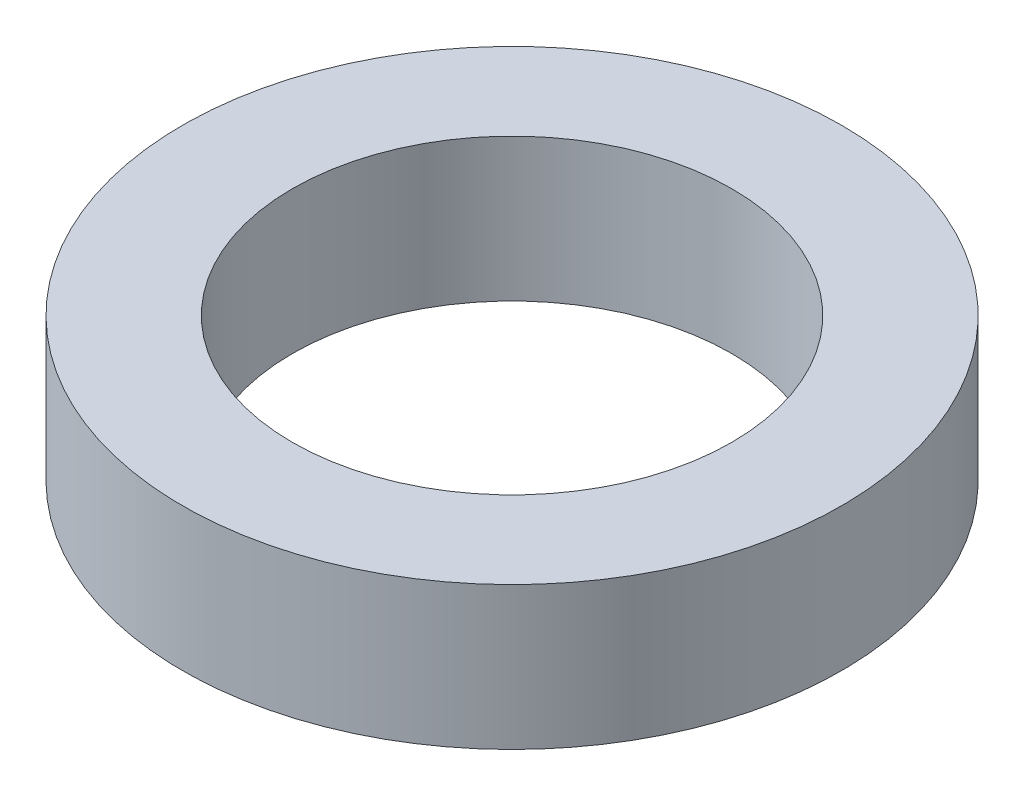
ISO-10303-21;
HEADER;
FILE_DESCRIPTION(('STEP AP214'),'2;1');
FILE_NAME('part.step','',(''),(''),'','','');
FILE_SCHEMA(('AUTOMOTIVE_DESIGN { 1 0 10303 214 1 1 1 1 }'));
ENDSEC;
DATA;
#1=APPLICATION_CONTEXT('core data for automotive mechanical design processes');
#2=APPLICATION_PROTOCOL_DEFINITION('international standard','automotive_design',2000,#1);
#3=PRODUCT_CONTEXT('',#1,'mechanical');
#4=PRODUCT('Part','Part','',(#3));
#5=PRODUCT_RELATED_PRODUCT_CATEGORY('part','',(#4));
#6=PRODUCT_DEFINITION_FORMATION('','',#4);
#7=PRODUCT_DEFINITION_CONTEXT('part definition',#1,'design');
#8=PRODUCT_DEFINITION('design','',#6,#7);
#9=PRODUCT_DEFINITION_SHAPE('','',#8);
#10=(LENGTH_UNIT() NAMED_UNIT(*) SI_UNIT(.MILLI.,.METRE.));
#11=(NAMED_UNIT(*) PLANE_ANGLE_UNIT() SI_UNIT($,.RADIAN.));
#12=(NAMED_UNIT(*) SI_UNIT($,.STERADIAN.) SOLID_ANGLE_UNIT());
#13=UNCERTAINTY_MEASURE_WITH_UNIT(LENGTH_MEASURE(1.E-05),#10,'distance_accuracy_value','');
#14=(GEOMETRIC_REPRESENTATION_CONTEXT(3) GLOBAL_UNCERTAINTY_ASSIGNED_CONTEXT((#13)) GLOBAL_UNIT_ASSIGNED_CONTEXT((#10,
#11,#12)) REPRESENTATION_CONTEXT('',''));
#15=CARTESIAN_POINT('',(0.,0.,0.));
#16=DIRECTION('',(0.,0.,1.));
#17=DIRECTION('',(1.,0.,0.));
#18=AXIS2_PLACEMENT_3D('',#15,#16,#17);
#19=CARTESIAN_POINT('',(0.,13.,0.));
#20=DIRECTION('',(0.,1.,0.));
#21=DIRECTION('',(0.,0.,1.));
#22=AXIS2_PLACEMENT_3D('',#19,#20,#21);
#23=PLANE('',#22);
#24=CARTESIAN_POINT('',(0.,13.,0.));
#25=DIRECTION('',(0.,1.,0.));
#26=DIRECTION('',(0.,0.,1.));
#27=AXIS2_PLACEMENT_3D('',#24,#25,#26);
#28=CIRCLE('',#27,30.);
#29=CARTESIAN_POINT('',(0.,13.,-30.));
#30=VERTEX_POINT('',#29);
#31=EDGE_CURVE('E10',#30,#30,#28,.T.);
#32=ORIENTED_EDGE('',*,*,#31,.T.);
#33=EDGE_LOOP('',(#32));
#34=FACE_BOUND('',#33,.T.);
#35=CARTESIAN_POINT('',(0.,13.,0.));
#36=DIRECTION('',(0.,1.,0.));
#37=DIRECTION('',(0.,0.,1.));
#38=AXIS2_PLACEMENT_3D('',#35,#36,#37);
#39=CIRCLE('',#38,20.);
#40=CARTESIAN_POINT('',(0.,13.,-20.));
#41=VERTEX_POINT('',#40);
#42=EDGE_CURVE('E42',#41,#41,#39,.T.);
#43=ORIENTED_EDGE('',*,*,#42,.F.);
#44=EDGE_LOOP('',(#43));
#45=FACE_BOUND('',#44,.T.);
#46=ADVANCED_FACE('F31',(#34,#45),#23,.T.);
#47=CARTESIAN_POINT('',(0.,0.,0.));
#48=DIRECTION('',(0.,1.,0.));
#49=DIRECTION('',(0.,0.,1.));
#50=AXIS2_PLACEMENT_3D('',#47,#48,#49);
#51=PLANE('',#50);
#52=CARTESIAN_POINT('',(0.,0.,0.));
#53=DIRECTION('',(0.,1.,0.));
#54=DIRECTION('',(0.,0.,1.));
#55=AXIS2_PLACEMENT_3D('',#52,#53,#54);
#56=CIRCLE('',#55,30.);
#57=CARTESIAN_POINT('',(0.,0.,-30.));
#58=VERTEX_POINT('',#57);
#59=EDGE_CURVE('E35',#58,#58,#56,.T.);
#60=ORIENTED_EDGE('',*,*,#59,.F.);
#61=EDGE_LOOP('',(#60));
#62=FACE_BOUND('',#61,.T.);
#63=CARTESIAN_POINT('',(0.,0.,0.));
#64=DIRECTION('',(0.,1.,0.));
#65=DIRECTION('',(0.,0.,1.));
#66=AXIS2_PLACEMENT_3D('',#63,#64,#65);
#67=CIRCLE('',#66,20.);
#68=CARTESIAN_POINT('',(0.,0.,-20.));
#69=VERTEX_POINT('',#68);
#70=EDGE_CURVE('E44',#69,#69,#67,.T.);
#71=ORIENTED_EDGE('',*,*,#70,.T.);
#72=EDGE_LOOP('',(#71));
#73=FACE_BOUND('',#72,.T.);
#74=ADVANCED_FACE('F54',(#62,#73),#51,.F.);
#75=CARTESIAN_POINT('',(0.,13.,0.));
#76=DIRECTION('',(0.,-1.,0.));
#77=DIRECTION('',(0.,0.,-1.));
#78=AXIS2_PLACEMENT_3D('',#75,#76,#77);
#79=CYLINDRICAL_SURFACE('',#78,30.);
#80=CARTESIAN_POINT('',(0.,13.,-30.));
#81=CARTESIAN_POINT('',(0.,12.8645833333333,-30.));
#82=CARTESIAN_POINT('',(0.,12.7291666666667,-30.));
#83=CARTESIAN_POINT('',(0.,12.4583333333333,-30.));
#84=CARTESIAN_POINT('',(0.,12.3229166666667,-30.));
#85=CARTESIAN_POINT('',(0.,12.0520833333333,-30.));
#86=CARTESIAN_POINT('',(0.,11.9166666666667,-30.));
#87=CARTESIAN_POINT('',(0.,11.6458333333333,-30.));
#88=CARTESIAN_POINT('',(0.,11.5104166666667,-30.));
#89=CARTESIAN_POINT('',(0.,11.2395833333333,-30.));
#90=CARTESIAN_POINT('',(0.,11.1041666666667,-30.));
#91=CARTESIAN_POINT('',(0.,10.8333333333333,-30.));
#92=CARTESIAN_POINT('',(0.,10.6979166666667,-30.));
#93=CARTESIAN_POINT('',(0.,10.4270833333333,-30.));
#94=CARTESIAN_POINT('',(0.,10.2916666666667,-30.));
#95=CARTESIAN_POINT('',(0.,10.0208333333333,-30.));
#96=CARTESIAN_POINT('',(0.,9.88541666666667,-30.));
#97=CARTESIAN_POINT('',(0.,9.61458333333333,-30.));
#98=CARTESIAN_POINT('',(0.,9.47916666666667,-30.));
#99=CARTESIAN_POINT('',(0.,9.20833333333333,-30.));
#100=CARTESIAN_POINT('',(0.,9.07291666666667,-30.));
#101=CARTESIAN_POINT('',(0.,8.80208333333333,-30.));
#102=CARTESIAN_POINT('',(0.,8.66666666666667,-30.));
#103=CARTESIAN_POINT('',(0.,8.39583333333333,-30.));
#104=CARTESIAN_POINT('',(0.,8.26041666666667,-30.));
#105=CARTESIAN_POINT('',(0.,7.98958333333333,-30.));
#106=CARTESIAN_POINT('',(0.,7.85416666666667,-30.));
#107=CARTESIAN_POINT('',(0.,7.58333333333333,-30.));
#108=CARTESIAN_POINT('',(0.,7.44791666666667,-30.));
#109=CARTESIAN_POINT('',(0.,7.17708333333333,-30.));
#110=CARTESIAN_POINT('',(0.,7.04166666666667,-30.));
#111=CARTESIAN_POINT('',(0.,6.77083333333333,-30.));
#112=CARTESIAN_POINT('',(0.,6.63541666666667,-30.));
#113=CARTESIAN_POINT('',(0.,6.36458333333333,-30.));
#114=CARTESIAN_POINT('',(0.,6.22916666666667,-30.));
#115=CARTESIAN_POINT('',(0.,5.95833333333333,-30.));
#116=CARTESIAN_POINT('',(0.,5.82291666666667,-30.));
#117=CARTESIAN_POINT('',(0.,5.55208333333333,-30.));
#118=CARTESIAN_POINT('',(0.,5.41666666666667,-30.));
#119=CARTESIAN_POINT('',(0.,5.14583333333333,-30.));
#120=CARTESIAN_POINT('',(0.,5.01041666666667,-30.));
#121=CARTESIAN_POINT('',(0.,4.73958333333333,-30.));
#122=CARTESIAN_POINT('',(0.,4.60416666666667,-30.));
#123=CARTESIAN_POINT('',(0.,4.33333333333333,-30.));
#124=CARTESIAN_POINT('',(0.,4.19791666666667,-30.));
#125=CARTESIAN_POINT('',(0.,3.92708333333333,-30.));
#126=CARTESIAN_POINT('',(0.,3.79166666666667,-30.));
#127=CARTESIAN_POINT('',(0.,3.52083333333333,-30.));
#128=CARTESIAN_POINT('',(0.,3.38541666666667,-30.));
#129=CARTESIAN_POINT('',(0.,3.11458333333333,-30.));
#130=CARTESIAN_POINT('',(0.,2.97916666666667,-30.));
#131=CARTESIAN_POINT('',(0.,2.70833333333333,-30.));
#132=CARTESIAN_POINT('',(0.,2.57291666666667,-30.));
#133=CARTESIAN_POINT('',(0.,2.30208333333333,-30.));
#134=CARTESIAN_POINT('',(0.,2.16666666666667,-30.));
#135=CARTESIAN_POINT('',(0.,1.89583333333333,-30.));
#136=CARTESIAN_POINT('',(0.,1.76041666666667,-30.));
#137=CARTESIAN_POINT('',(0.,1.48958333333333,-30.));
#138=CARTESIAN_POINT('',(0.,1.35416666666667,-30.));
#139=CARTESIAN_POINT('',(0.,1.08333333333333,-30.));
#140=CARTESIAN_POINT('',(0.,0.947916666666667,-30.));
#141=CARTESIAN_POINT('',(0.,0.677083333333334,-30.));
#142=CARTESIAN_POINT('',(0.,0.541666666666667,-30.));
#143=CARTESIAN_POINT('',(0.,0.270833333333334,-30.));
#144=CARTESIAN_POINT('',(0.,0.135416666666667,-30.));
#145=CARTESIAN_POINT('',(0.,0.,-30.));
#146=B_SPLINE_CURVE_WITH_KNOTS('',3,(#80,#81,#82,#83,#84,#85,#86,#87,#88,#89,#90,#91,#92,#93,
#94,#95,#96,#97,#98,#99,#100,#101,#102,#103,#104,#105,#106,#107,#108,#109,#110,#111,#112,#113,
#114,#115,#116,#117,#118,#119,#120,#121,#122,#123,#124,#125,#126,#127,#128,#129,#130,#131,#132,
#133,#134,#135,#136,#137,#138,#139,#140,#141,#142,#143,#144,#145),.UNSPECIFIED.,.F.,.F.,(4,2,2,
2,2,2,2,2,2,2,2,2,2,2,2,2,2,2,2,2,2,2,2,2,2,2,2,2,2,2,2,2,4),(0.,0.406249999999999,
0.812499999999999,1.21875,1.625,2.03125,2.4375,2.84375,3.25,3.65625,4.0625,4.46875,4.875,
5.28125,5.6875,6.09375,6.5,6.90625,7.3125,7.71875,8.125,8.53125,8.9375,9.34375,9.75,10.15625,
10.5625,10.96875,11.375,11.78125,12.1875,12.59375,13.),.UNSPECIFIED.);
#147=EDGE_CURVE('BSEAM33',#30,#58,#146,.T.);
#148=ORIENTED_EDGE('',*,*,#31,.F.);
#149=ORIENTED_EDGE('',*,*,#59,.T.);
#150=ORIENTED_EDGE('',*,*,#147,.T.);
#151=ORIENTED_EDGE('',*,*,#147,.F.);
#152=EDGE_LOOP('',(#148,#150,#149,#151));
#153=FACE_BOUND('',#152,.T.);
#154=ADVANCED_FACE('F33',(#153),#79,.T.);
#155=CARTESIAN_POINT('',(0.,13.,0.));
#156=DIRECTION('',(0.,-1.,0.));
#157=DIRECTION('',(0.,0.,-1.));
#158=AXIS2_PLACEMENT_3D('',#155,#156,#157);
#159=CYLINDRICAL_SURFACE('',#158,20.);
#160=CARTESIAN_POINT('',(0.,13.,-20.));
#161=CARTESIAN_POINT('',(0.,12.8645833333333,-20.));
#162=CARTESIAN_POINT('',(0.,12.7291666666667,-20.));
#163=CARTESIAN_POINT('',(0.,12.4583333333333,-20.));
#164=CARTESIAN_POINT('',(0.,12.3229166666667,-20.));
#165=CARTESIAN_POINT('',(0.,12.0520833333333,-20.));
#166=CARTESIAN_POINT('',(0.,11.9166666666667,-20.));
#167=CARTESIAN_POINT('',(0.,11.6458333333333,-20.));
#168=CARTESIAN_POINT('',(0.,11.5104166666667,-20.));
#169=CARTESIAN_POINT('',(0.,11.2395833333333,-20.));
#170=CARTESIAN_POINT('',(0.,11.1041666666667,-20.));
#171=CARTESIAN_POINT('',(0.,10.8333333333333,-20.));
#172=CARTESIAN_POINT('',(0.,10.6979166666667,-20.));
#173=CARTESIAN_POINT('',(0.,10.4270833333333,-20.));
#174=CARTESIAN_POINT('',(0.,10.2916666666667,-20.));
#175=CARTESIAN_POINT('',(0.,10.0208333333333,-20.));
#176=CARTESIAN_POINT('',(0.,9.88541666666667,-20.));
#177=CARTESIAN_POINT('',(0.,9.61458333333333,-20.));
#178=CARTESIAN_POINT('',(0.,9.47916666666667,-20.));
#179=CARTESIAN_POINT('',(0.,9.20833333333333,-20.));
#180=CARTESIAN_POINT('',(0.,9.07291666666666,-20.));
#181=CARTESIAN_POINT('',(0.,8.80208333333333,-20.));
#182=CARTESIAN_POINT('',(0.,8.66666666666667,-20.));
#183=CARTESIAN_POINT('',(0.,8.39583333333333,-20.));
#184=CARTESIAN_POINT('',(0.,8.26041666666667,-20.));
#185=CARTESIAN_POINT('',(0.,7.98958333333333,-20.));
#186=CARTESIAN_POINT('',(0.,7.85416666666667,-20.));
#187=CARTESIAN_POINT('',(0.,7.58333333333333,-20.));
#188=CARTESIAN_POINT('',(0.,7.44791666666667,-20.));
#189=CARTESIAN_POINT('',(0.,7.17708333333333,-20.));
#190=CARTESIAN_POINT('',(0.,7.04166666666667,-20.));
#191=CARTESIAN_POINT('',(0.,6.77083333333333,-20.));
#192=CARTESIAN_POINT('',(0.,6.63541666666667,-20.));
#193=CARTESIAN_POINT('',(0.,6.36458333333333,-20.));
#194=CARTESIAN_POINT('',(0.,6.22916666666667,-20.));
#195=CARTESIAN_POINT('',(0.,5.95833333333333,-20.));
#196=CARTESIAN_POINT('',(0.,5.82291666666667,-20.));
#197=CARTESIAN_POINT('',(0.,5.55208333333333,-20.));
#198=CARTESIAN_POINT('',(0.,5.41666666666667,-20.));
#199=CARTESIAN_POINT('',(0.,5.14583333333333,-20.));
#200=CARTESIAN_POINT('',(0.,5.01041666666667,-20.));
#201=CARTESIAN_POINT('',(0.,4.73958333333333,-20.));
#202=CARTESIAN_POINT('',(0.,4.60416666666667,-20.));
#203=CARTESIAN_POINT('',(0.,4.33333333333333,-20.));
#204=CARTESIAN_POINT('',(0.,4.19791666666667,-20.));
#205=CARTESIAN_POINT('',(0.,3.92708333333333,-20.));
#206=CARTESIAN_POINT('',(0.,3.79166666666667,-20.));
#207=CARTESIAN_POINT('',(0.,3.52083333333333,-20.));
#208=CARTESIAN_POINT('',(0.,3.38541666666667,-20.));
#209=CARTESIAN_POINT('',(0.,3.11458333333333,-20.));
#210=CARTESIAN_POINT('',(0.,2.97916666666667,-20.));
#211=CARTESIAN_POINT('',(0.,2.70833333333333,-20.));
#212=CARTESIAN_POINT('',(0.,2.57291666666667,-20.));
#213=CARTESIAN_POINT('',(0.,2.30208333333333,-20.));
#214=CARTESIAN_POINT('',(0.,2.16666666666667,-20.));
#215=CARTESIAN_POINT('',(0.,1.89583333333333,-20.));
#216=CARTESIAN_POINT('',(0.,1.76041666666667,-20.));
#217=CARTESIAN_POINT('',(0.,1.48958333333333,-20.));
#218=CARTESIAN_POINT('',(0.,1.35416666666667,-20.));
#219=CARTESIAN_POINT('',(0.,1.08333333333333,-20.));
#220=CARTESIAN_POINT('',(0.,0.947916666666667,-20.));
#221=CARTESIAN_POINT('',(0.,0.677083333333334,-20.));
#222=CARTESIAN_POINT('',(0.,0.541666666666667,-20.));
#223=CARTESIAN_POINT('',(0.,0.270833333333334,-20.));
#224=CARTESIAN_POINT('',(0.,0.135416666666667,-20.));
#225=CARTESIAN_POINT('',(0.,0.,-20.));
#226=B_SPLINE_CURVE_WITH_KNOTS('',3,(#160,#161,#162,#163,#164,#165,#166,#167,#168,#169,#170,
#171,#172,#173,#174,#175,#176,#177,#178,#179,#180,#181,#182,#183,#184,#185,#186,#187,#188,#189,
#190,#191,#192,#193,#194,#195,#196,#197,#198,#199,#200,#201,#202,#203,#204,#205,#206,#207,#208,
#209,#210,#211,#212,#213,#214,#215,#216,#217,#218,#219,#220,#221,#222,#223,#224,#225),
.UNSPECIFIED.,.F.,.F.,(4,2,2,2,2,2,2,2,2,2,2,2,2,2,2,2,2,2,2,2,2,2,2,2,2,2,2,2,2,2,2,2,4),(0.,
0.40625,0.812500000000001,1.21875,1.625,2.03125,2.4375,2.84375,3.25,3.65625,4.0625,4.46875,
4.875,5.28125,5.6875,6.09375,6.5,6.90625,7.3125,7.71875,8.125,8.53125,8.9375,9.34375,9.75,
10.15625,10.5625,10.96875,11.375,11.78125,12.1875,12.59375,13.),.UNSPECIFIED.);
#227=EDGE_CURVE('BSEAM50',#41,#69,#226,.T.);
#228=ORIENTED_EDGE('',*,*,#42,.T.);
#229=ORIENTED_EDGE('',*,*,#70,.F.);
#230=ORIENTED_EDGE('',*,*,#227,.T.);
#231=ORIENTED_EDGE('',*,*,#227,.F.);
#232=EDGE_LOOP('',(#228,#230,#229,#231));
#233=FACE_BOUND('',#232,.T.);
#234=ADVANCED_FACE('F50',(#233),#159,.F.);
#235=CLOSED_SHELL('',(#46,#74,#154,#234));
#236=MANIFOLD_SOLID_BREP('B2',#235);
#237=ADVANCED_BREP_SHAPE_REPRESENTATION('',(#18,#236),#14);
#238=SHAPE_DEFINITION_REPRESENTATION(#9,#237);
ENDSEC;
END-ISO-10303-21;
